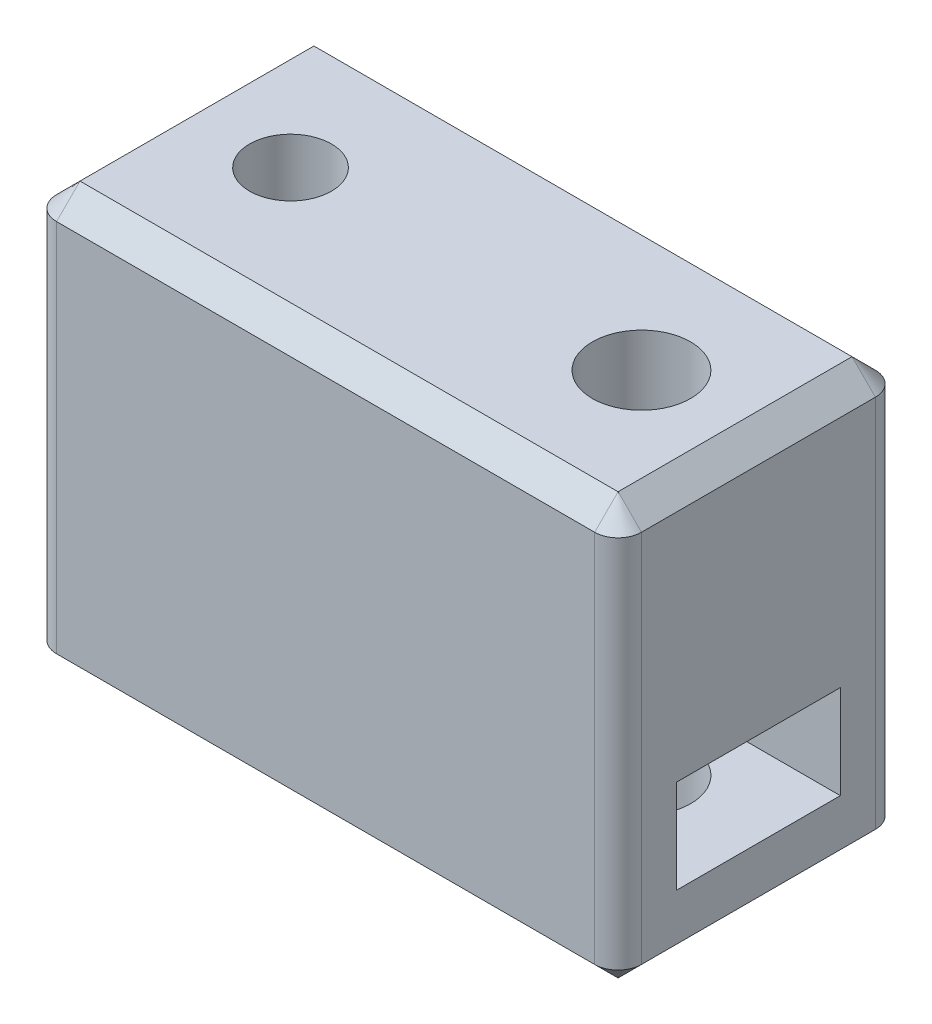
ISO-10303-21;
HEADER;
FILE_DESCRIPTION(('STEP AP214'),'2;1');
FILE_NAME('part.step','',(''),(''),'','','');
FILE_SCHEMA(('AUTOMOTIVE_DESIGN { 1 0 10303 214 1 1 1 1 }'));
ENDSEC;
DATA;
#1=APPLICATION_CONTEXT('core data for automotive mechanical design processes');
#2=APPLICATION_PROTOCOL_DEFINITION('international standard','automotive_design',2000,#1);
#3=PRODUCT_CONTEXT('',#1,'mechanical');
#4=PRODUCT('Part','Part','',(#3));
#5=PRODUCT_RELATED_PRODUCT_CATEGORY('part','',(#4));
#6=PRODUCT_DEFINITION_FORMATION('','',#4);
#7=PRODUCT_DEFINITION_CONTEXT('part definition',#1,'design');
#8=PRODUCT_DEFINITION('design','',#6,#7);
#9=PRODUCT_DEFINITION_SHAPE('','',#8);
#10=(LENGTH_UNIT() NAMED_UNIT(*) SI_UNIT(.MILLI.,.METRE.));
#11=(NAMED_UNIT(*) PLANE_ANGLE_UNIT() SI_UNIT($,.RADIAN.));
#12=(NAMED_UNIT(*) SI_UNIT($,.STERADIAN.) SOLID_ANGLE_UNIT());
#13=UNCERTAINTY_MEASURE_WITH_UNIT(LENGTH_MEASURE(1.E-05),#10,'distance_accuracy_value','');
#14=(GEOMETRIC_REPRESENTATION_CONTEXT(3) GLOBAL_UNCERTAINTY_ASSIGNED_CONTEXT((#13)) GLOBAL_UNIT_ASSIGNED_CONTEXT((#10,
#11,#12)) REPRESENTATION_CONTEXT('',''));
#15=CARTESIAN_POINT('',(0.,0.,0.));
#16=DIRECTION('',(0.,0.,1.));
#17=DIRECTION('',(1.,0.,0.));
#18=AXIS2_PLACEMENT_3D('',#15,#16,#17);
#19=CARTESIAN_POINT('',(-7.5,18.,0.));
#20=DIRECTION('',(0.,-1.,0.));
#21=DIRECTION('',(0.,0.,-1.));
#22=AXIS2_PLACEMENT_3D('',#19,#20,#21);
#23=CYLINDRICAL_SURFACE('',#22,1.75);
#24=CARTESIAN_POINT('',(-7.5,3.,0.));
#25=DIRECTION('',(0.,-1.,0.));
#26=DIRECTION('',(0.,0.,-1.));
#27=AXIS2_PLACEMENT_3D('',#24,#25,#26);
#28=CIRCLE('',#27,1.75);
#29=CARTESIAN_POINT('',(-7.5,3.,-1.75));
#30=VERTEX_POINT('',#29);
#31=EDGE_CURVE('E237',#30,#30,#28,.T.);
#32=ORIENTED_EDGE('',*,*,#31,.F.);
#33=EDGE_LOOP('',(#32));
#34=FACE_BOUND('',#33,.T.);
#35=CARTESIAN_POINT('',(-7.5,0.,0.));
#36=DIRECTION('',(0.,1.,0.));
#37=DIRECTION('',(0.,0.,1.));
#38=AXIS2_PLACEMENT_3D('',#35,#36,#37);
#39=CIRCLE('',#38,1.75);
#40=CARTESIAN_POINT('',(-7.5,0.,1.75));
#41=VERTEX_POINT('',#40);
#42=EDGE_CURVE('E257',#41,#41,#39,.T.);
#43=ORIENTED_EDGE('',*,*,#42,.F.);
#44=EDGE_LOOP('',(#43));
#45=FACE_BOUND('',#44,.T.);
#46=ADVANCED_FACE('F34',(#34,#45),#23,.F.);
#47=CARTESIAN_POINT('',(7.5,18.,0.));
#48=DIRECTION('',(0.,-1.,0.));
#49=DIRECTION('',(0.,0.,-1.));
#50=AXIS2_PLACEMENT_3D('',#47,#48,#49);
#51=CYLINDRICAL_SURFACE('',#50,2.1);
#52=CARTESIAN_POINT('',(7.5,3.,0.));
#53=DIRECTION('',(0.,-1.,0.));
#54=DIRECTION('',(0.,0.,-1.));
#55=AXIS2_PLACEMENT_3D('',#52,#53,#54);
#56=CIRCLE('',#55,2.1);
#57=CARTESIAN_POINT('',(7.5,3.,-2.1));
#58=VERTEX_POINT('',#57);
#59=EDGE_CURVE('E261',#58,#58,#56,.T.);
#60=ORIENTED_EDGE('',*,*,#59,.F.);
#61=EDGE_LOOP('',(#60));
#62=FACE_BOUND('',#61,.T.);
#63=CARTESIAN_POINT('',(7.5,0.,0.));
#64=DIRECTION('',(0.,1.,0.));
#65=DIRECTION('',(0.,0.,1.));
#66=AXIS2_PLACEMENT_3D('',#63,#64,#65);
#67=CIRCLE('',#66,2.1);
#68=CARTESIAN_POINT('',(7.5,0.,2.1));
#69=VERTEX_POINT('',#68);
#70=EDGE_CURVE('E258',#69,#69,#67,.T.);
#71=ORIENTED_EDGE('',*,*,#70,.F.);
#72=EDGE_LOOP('',(#71));
#73=FACE_BOUND('',#72,.T.);
#74=ADVANCED_FACE('F462',(#62,#73),#51,.F.);
#75=CARTESIAN_POINT('',(0.,18.,0.));
#76=DIRECTION('',(0.,1.,0.));
#77=DIRECTION('',(0.,0.,1.));
#78=AXIS2_PLACEMENT_3D('',#75,#76,#77);
#79=PLANE('',#78);
#80=DIRECTION('',(0.,0.,-1.));
#81=VECTOR('',#80,1.);
#82=CARTESIAN_POINT('',(11.5,18.,-5.));
#83=LINE('',#82,#81);
#84=CARTESIAN_POINT('',(11.5,18.,5.00000000000001));
#85=VERTEX_POINT('',#84);
#86=CARTESIAN_POINT('',(11.5,18.,-5.));
#87=VERTEX_POINT('',#86);
#88=EDGE_CURVE('E59',#85,#87,#83,.T.);
#89=ORIENTED_EDGE('',*,*,#88,.T.);
#90=DIRECTION('',(-1.,0.,0.));
#91=VECTOR('',#90,1.);
#92=CARTESIAN_POINT('',(-11.5,18.,-5.00000000000001));
#93=LINE('',#92,#91);
#94=CARTESIAN_POINT('',(-11.5,18.,-5.));
#95=VERTEX_POINT('',#94);
#96=EDGE_CURVE('E11',#87,#95,#93,.T.);
#97=ORIENTED_EDGE('',*,*,#96,.T.);
#98=DIRECTION('',(0.,0.,1.));
#99=VECTOR('',#98,1.);
#100=CARTESIAN_POINT('',(-11.5,18.,5.));
#101=LINE('',#100,#99);
#102=CARTESIAN_POINT('',(-11.5,18.,5.00000000000001));
#103=VERTEX_POINT('',#102);
#104=EDGE_CURVE('E44',#95,#103,#101,.T.);
#105=ORIENTED_EDGE('',*,*,#104,.T.);
#106=DIRECTION('',(1.,0.,0.));
#107=VECTOR('',#106,1.);
#108=CARTESIAN_POINT('',(11.5,18.,5.00000000000001));
#109=LINE('',#108,#107);
#110=EDGE_CURVE('E342',#103,#85,#109,.T.);
#111=ORIENTED_EDGE('',*,*,#110,.T.);
#112=EDGE_LOOP('',(#89,#97,#105,#111));
#113=FACE_BOUND('',#112,.T.);
#114=CARTESIAN_POINT('',(-7.5,18.,0.));
#115=DIRECTION('',(0.,1.,0.));
#116=DIRECTION('',(0.,0.,1.));
#117=AXIS2_PLACEMENT_3D('',#114,#115,#116);
#118=CIRCLE('',#117,1.75);
#119=CARTESIAN_POINT('',(-7.5,18.,1.75));
#120=VERTEX_POINT('',#119);
#121=EDGE_CURVE('E262',#120,#120,#118,.T.);
#122=ORIENTED_EDGE('',*,*,#121,.F.);
#123=EDGE_LOOP('',(#122));
#124=FACE_BOUND('',#123,.T.);
#125=CARTESIAN_POINT('',(7.5,18.,0.));
#126=DIRECTION('',(0.,1.,0.));
#127=DIRECTION('',(0.,0.,1.));
#128=AXIS2_PLACEMENT_3D('',#125,#126,#127);
#129=CIRCLE('',#128,2.1);
#130=CARTESIAN_POINT('',(7.5,18.,2.1));
#131=VERTEX_POINT('',#130);
#132=EDGE_CURVE('E254',#131,#131,#129,.T.);
#133=ORIENTED_EDGE('',*,*,#132,.F.);
#134=EDGE_LOOP('',(#133));
#135=FACE_BOUND('',#134,.T.);
#136=ADVANCED_FACE('F459',(#113,#124,#135),#79,.T.);
#137=CARTESIAN_POINT('',(0.,0.,0.));
#138=DIRECTION('',(0.,1.,0.));
#139=DIRECTION('',(0.,0.,1.));
#140=AXIS2_PLACEMENT_3D('',#137,#138,#139);
#141=PLANE('',#140);
#142=DIRECTION('',(0.,0.,-1.));
#143=VECTOR('',#142,1.);
#144=CARTESIAN_POINT('',(-11.5,0.,0.));
#145=LINE('',#144,#143);
#146=CARTESIAN_POINT('',(-11.5,0.,5.));
#147=VERTEX_POINT('',#146);
#148=CARTESIAN_POINT('',(-11.5,0.,-5.));
#149=VERTEX_POINT('',#148);
#150=EDGE_CURVE('E309',#147,#149,#145,.T.);
#151=ORIENTED_EDGE('',*,*,#150,.T.);
#152=DIRECTION('',(1.,0.,0.));
#153=VECTOR('',#152,1.);
#154=CARTESIAN_POINT('',(0.,0.,-5.));
#155=LINE('',#154,#153);
#156=CARTESIAN_POINT('',(11.5,0.,-5.));
#157=VERTEX_POINT('',#156);
#158=EDGE_CURVE('E311',#149,#157,#155,.T.);
#159=ORIENTED_EDGE('',*,*,#158,.T.);
#160=DIRECTION('',(0.,0.,1.));
#161=VECTOR('',#160,1.);
#162=CARTESIAN_POINT('',(11.5,0.,0.));
#163=LINE('',#162,#161);
#164=CARTESIAN_POINT('',(11.5,0.,5.));
#165=VERTEX_POINT('',#164);
#166=EDGE_CURVE('E307',#157,#165,#163,.T.);
#167=ORIENTED_EDGE('',*,*,#166,.T.);
#168=DIRECTION('',(-1.,0.,0.));
#169=VECTOR('',#168,1.);
#170=CARTESIAN_POINT('',(0.,0.,5.));
#171=LINE('',#170,#169);
#172=EDGE_CURVE('E305',#165,#147,#171,.T.);
#173=ORIENTED_EDGE('',*,*,#172,.T.);
#174=EDGE_LOOP('',(#151,#159,#167,#173));
#175=FACE_BOUND('',#174,.T.);
#176=ORIENTED_EDGE('',*,*,#42,.T.);
#177=EDGE_LOOP('',(#176));
#178=FACE_BOUND('',#177,.T.);
#179=ORIENTED_EDGE('',*,*,#70,.T.);
#180=EDGE_LOOP('',(#179));
#181=FACE_BOUND('',#180,.T.);
#182=ADVANCED_FACE('F415',(#175,#178,#181),#141,.F.);
#183=CARTESIAN_POINT('',(12.5,18.,-6.));
#184=DIRECTION('',(-1.,0.,0.));
#185=DIRECTION('',(0.,0.,1.));
#186=AXIS2_PLACEMENT_3D('',#183,#184,#185);
#187=PLANE('',#186);
#188=DIRECTION('',(0.,0.,1.));
#189=VECTOR('',#188,1.);
#190=CARTESIAN_POINT('',(12.5,7.,3.5));
#191=LINE('',#190,#189);
#192=CARTESIAN_POINT('',(12.5,7.,-3.5));
#193=VERTEX_POINT('',#192);
#194=CARTESIAN_POINT('',(12.5,7.,3.5));
#195=VERTEX_POINT('',#194);
#196=EDGE_CURVE('E236',#193,#195,#191,.T.);
#197=ORIENTED_EDGE('',*,*,#196,.F.);
#198=DIRECTION('',(0.,1.,0.));
#199=VECTOR('',#198,1.);
#200=CARTESIAN_POINT('',(12.5,7.,-3.5));
#201=LINE('',#200,#199);
#202=CARTESIAN_POINT('',(12.5,3.,-3.5));
#203=VERTEX_POINT('',#202);
#204=EDGE_CURVE('E234',#203,#193,#201,.T.);
#205=ORIENTED_EDGE('',*,*,#204,.F.);
#206=DIRECTION('',(0.,0.,-1.));
#207=VECTOR('',#206,1.);
#208=CARTESIAN_POINT('',(12.5,3.,3.5));
#209=LINE('',#208,#207);
#210=CARTESIAN_POINT('',(12.5,3.,3.5));
#211=VERTEX_POINT('',#210);
#212=EDGE_CURVE('E224',#211,#203,#209,.T.);
#213=ORIENTED_EDGE('',*,*,#212,.F.);
#214=DIRECTION('',(0.,-1.,0.));
#215=VECTOR('',#214,1.);
#216=CARTESIAN_POINT('',(12.5,7.,3.5));
#217=LINE('',#216,#215);
#218=EDGE_CURVE('E240',#195,#211,#217,.T.);
#219=ORIENTED_EDGE('',*,*,#218,.F.);
#220=EDGE_LOOP('',(#197,#205,#213,#219));
#221=FACE_BOUND('',#220,.T.);
#222=DIRECTION('',(0.,-1.,0.));
#223=VECTOR('',#222,1.);
#224=CARTESIAN_POINT('',(12.5,18.,5.));
#225=LINE('',#224,#223);
#226=CARTESIAN_POINT('',(12.5,17.,5.));
#227=VERTEX_POINT('',#226);
#228=CARTESIAN_POINT('',(12.5,0.999999999999997,5.));
#229=VERTEX_POINT('',#228);
#230=EDGE_CURVE('E293',#227,#229,#225,.T.);
#231=ORIENTED_EDGE('',*,*,#230,.T.);
#232=DIRECTION('',(0.,0.,-1.));
#233=VECTOR('',#232,1.);
#234=CARTESIAN_POINT('',(12.5,0.999999999999997,-6.));
#235=LINE('',#234,#233);
#236=CARTESIAN_POINT('',(12.5,0.999999999999997,-5.));
#237=VERTEX_POINT('',#236);
#238=EDGE_CURVE('E328',#229,#237,#235,.T.);
#239=ORIENTED_EDGE('',*,*,#238,.T.);
#240=DIRECTION('',(0.,-1.,0.));
#241=VECTOR('',#240,1.);
#242=CARTESIAN_POINT('',(12.5,18.,-5.));
#243=LINE('',#242,#241);
#244=CARTESIAN_POINT('',(12.5,17.,-5.));
#245=VERTEX_POINT('',#244);
#246=EDGE_CURVE('E296',#237,#245,#243,.F.);
#247=ORIENTED_EDGE('',*,*,#246,.T.);
#248=DIRECTION('',(0.,0.,1.));
#249=VECTOR('',#248,1.);
#250=CARTESIAN_POINT('',(12.5,17.,5.));
#251=LINE('',#250,#249);
#252=EDGE_CURVE('E326',#245,#227,#251,.T.);
#253=ORIENTED_EDGE('',*,*,#252,.T.);
#254=EDGE_LOOP('',(#231,#239,#247,#253));
#255=FACE_BOUND('',#254,.T.);
#256=ADVANCED_FACE('F428',(#221,#255),#187,.F.);
#257=CARTESIAN_POINT('',(-12.5,18.,-6.));
#258=DIRECTION('',(0.,0.,1.));
#259=DIRECTION('',(1.,0.,0.));
#260=AXIS2_PLACEMENT_3D('',#257,#258,#259);
#261=PLANE('',#260);
#262=DIRECTION('',(0.,-1.,0.));
#263=VECTOR('',#262,1.);
#264=CARTESIAN_POINT('',(11.5,18.,-6.));
#265=LINE('',#264,#263);
#266=CARTESIAN_POINT('',(11.5,17.,-6.));
#267=VERTEX_POINT('',#266);
#268=CARTESIAN_POINT('',(11.5,0.999999999999997,-6.));
#269=VERTEX_POINT('',#268);
#270=EDGE_CURVE('E287',#267,#269,#265,.T.);
#271=ORIENTED_EDGE('',*,*,#270,.T.);
#272=DIRECTION('',(-1.,0.,0.));
#273=VECTOR('',#272,1.);
#274=CARTESIAN_POINT('',(-12.5,0.999999999999997,-6.));
#275=LINE('',#274,#273);
#276=CARTESIAN_POINT('',(-11.5,0.999999999999997,-6.));
#277=VERTEX_POINT('',#276);
#278=EDGE_CURVE('E302',#269,#277,#275,.T.);
#279=ORIENTED_EDGE('',*,*,#278,.T.);
#280=DIRECTION('',(0.,-1.,0.));
#281=VECTOR('',#280,1.);
#282=CARTESIAN_POINT('',(-11.5,18.,-6.));
#283=LINE('',#282,#281);
#284=CARTESIAN_POINT('',(-11.5,17.,-6.));
#285=VERTEX_POINT('',#284);
#286=EDGE_CURVE('E290',#277,#285,#283,.F.);
#287=ORIENTED_EDGE('',*,*,#286,.T.);
#288=DIRECTION('',(1.,0.,0.));
#289=VECTOR('',#288,1.);
#290=CARTESIAN_POINT('',(11.5,17.,-6.));
#291=LINE('',#290,#289);
#292=EDGE_CURVE('E299',#285,#267,#291,.T.);
#293=ORIENTED_EDGE('',*,*,#292,.T.);
#294=EDGE_LOOP('',(#271,#279,#287,#293));
#295=FACE_BOUND('',#294,.T.);
#296=ADVANCED_FACE('F446',(#295),#261,.F.);
#297=CARTESIAN_POINT('',(-12.5,18.,-6.));
#298=DIRECTION('',(1.,0.,0.));
#299=DIRECTION('',(0.,0.,-1.));
#300=AXIS2_PLACEMENT_3D('',#297,#298,#299);
#301=PLANE('',#300);
#302=DIRECTION('',(0.,0.,-1.));
#303=VECTOR('',#302,1.);
#304=CARTESIAN_POINT('',(-12.5,6.,-2.75));
#305=LINE('',#304,#303);
#306=CARTESIAN_POINT('',(-12.5,6.,2.75));
#307=VERTEX_POINT('',#306);
#308=CARTESIAN_POINT('',(-12.5,6.,-2.75));
#309=VERTEX_POINT('',#308);
#310=EDGE_CURVE('E209',#307,#309,#305,.T.);
#311=ORIENTED_EDGE('',*,*,#310,.F.);
#312=DIRECTION('',(0.,1.,0.));
#313=VECTOR('',#312,1.);
#314=CARTESIAN_POINT('',(-12.5,3.,2.75));
#315=LINE('',#314,#313);
#316=CARTESIAN_POINT('',(-12.5,3.,2.75));
#317=VERTEX_POINT('',#316);
#318=EDGE_CURVE('E183',#317,#307,#315,.T.);
#319=ORIENTED_EDGE('',*,*,#318,.F.);
#320=DIRECTION('',(0.,0.,1.));
#321=VECTOR('',#320,1.);
#322=CARTESIAN_POINT('',(-12.5,3.,-2.75));
#323=LINE('',#322,#321);
#324=CARTESIAN_POINT('',(-12.5,3.,-2.75));
#325=VERTEX_POINT('',#324);
#326=EDGE_CURVE('E200',#325,#317,#323,.T.);
#327=ORIENTED_EDGE('',*,*,#326,.F.);
#328=DIRECTION('',(0.,-1.,0.));
#329=VECTOR('',#328,1.);
#330=CARTESIAN_POINT('',(-12.5,3.,-2.75));
#331=LINE('',#330,#329);
#332=EDGE_CURVE('E203',#309,#325,#331,.T.);
#333=ORIENTED_EDGE('',*,*,#332,.F.);
#334=EDGE_LOOP('',(#311,#319,#327,#333));
#335=FACE_BOUND('',#334,.T.);
#336=DIRECTION('',(0.,-1.,0.));
#337=VECTOR('',#336,1.);
#338=CARTESIAN_POINT('',(-12.5,18.,-5.));
#339=LINE('',#338,#337);
#340=CARTESIAN_POINT('',(-12.5,17.,-5.));
#341=VERTEX_POINT('',#340);
#342=CARTESIAN_POINT('',(-12.5,0.999999999999997,-5.));
#343=VERTEX_POINT('',#342);
#344=EDGE_CURVE('E281',#341,#343,#339,.T.);
#345=ORIENTED_EDGE('',*,*,#344,.T.);
#346=DIRECTION('',(0.,0.,1.));
#347=VECTOR('',#346,1.);
#348=CARTESIAN_POINT('',(-12.5,0.999999999999997,-6.));
#349=LINE('',#348,#347);
#350=CARTESIAN_POINT('',(-12.5,0.999999999999997,5.));
#351=VERTEX_POINT('',#350);
#352=EDGE_CURVE('E324',#343,#351,#349,.T.);
#353=ORIENTED_EDGE('',*,*,#352,.T.);
#354=DIRECTION('',(0.,-1.,0.));
#355=VECTOR('',#354,1.);
#356=CARTESIAN_POINT('',(-12.5,18.,5.));
#357=LINE('',#356,#355);
#358=CARTESIAN_POINT('',(-12.5,17.,5.));
#359=VERTEX_POINT('',#358);
#360=EDGE_CURVE('E284',#351,#359,#357,.F.);
#361=ORIENTED_EDGE('',*,*,#360,.T.);
#362=DIRECTION('',(0.,0.,-1.));
#363=VECTOR('',#362,1.);
#364=CARTESIAN_POINT('',(-12.5,17.,-5.));
#365=LINE('',#364,#363);
#366=EDGE_CURVE('E322',#359,#341,#365,.T.);
#367=ORIENTED_EDGE('',*,*,#366,.T.);
#368=EDGE_LOOP('',(#345,#353,#361,#367));
#369=FACE_BOUND('',#368,.T.);
#370=ADVANCED_FACE('F497',(#335,#369),#301,.F.);
#371=CARTESIAN_POINT('',(-12.5,18.,6.));
#372=DIRECTION('',(0.,0.,-1.));
#373=DIRECTION('',(-1.,0.,0.));
#374=AXIS2_PLACEMENT_3D('',#371,#372,#373);
#375=PLANE('',#374);
#376=DIRECTION('',(0.,-1.,0.));
#377=VECTOR('',#376,1.);
#378=CARTESIAN_POINT('',(-11.5,18.,6.));
#379=LINE('',#378,#377);
#380=CARTESIAN_POINT('',(-11.5,17.,6.));
#381=VERTEX_POINT('',#380);
#382=CARTESIAN_POINT('',(-11.5,0.999999999999997,6.));
#383=VERTEX_POINT('',#382);
#384=EDGE_CURVE('E278',#381,#383,#379,.T.);
#385=ORIENTED_EDGE('',*,*,#384,.T.);
#386=DIRECTION('',(1.,0.,0.));
#387=VECTOR('',#386,1.);
#388=CARTESIAN_POINT('',(-12.5,0.999999999999997,6.));
#389=LINE('',#388,#387);
#390=CARTESIAN_POINT('',(11.5,0.999999999999997,6.));
#391=VERTEX_POINT('',#390);
#392=EDGE_CURVE('E340',#383,#391,#389,.T.);
#393=ORIENTED_EDGE('',*,*,#392,.T.);
#394=DIRECTION('',(0.,-1.,0.));
#395=VECTOR('',#394,1.);
#396=CARTESIAN_POINT('',(11.5,18.,6.));
#397=LINE('',#396,#395);
#398=CARTESIAN_POINT('',(11.5,17.,6.));
#399=VERTEX_POINT('',#398);
#400=EDGE_CURVE('E265',#391,#399,#397,.F.);
#401=ORIENTED_EDGE('',*,*,#400,.T.);
#402=DIRECTION('',(-1.,0.,0.));
#403=VECTOR('',#402,1.);
#404=CARTESIAN_POINT('',(-11.5,17.,6.));
#405=LINE('',#404,#403);
#406=EDGE_CURVE('E338',#399,#381,#405,.T.);
#407=ORIENTED_EDGE('',*,*,#406,.T.);
#408=EDGE_LOOP('',(#385,#393,#401,#407));
#409=FACE_BOUND('',#408,.T.);
#410=ADVANCED_FACE('F397',(#409),#375,.F.);
#411=CARTESIAN_POINT('',(-7.5,6.,0.));
#412=DIRECTION('',(0.,1.,0.));
#413=DIRECTION('',(0.,0.,1.));
#414=AXIS2_PLACEMENT_3D('',#411,#412,#413);
#415=CIRCLE('',#414,1.75);
#416=CARTESIAN_POINT('',(-7.5,6.,1.75));
#417=VERTEX_POINT('',#416);
#418=EDGE_CURVE('E216',#417,#417,#415,.T.);
#419=ORIENTED_EDGE('',*,*,#418,.F.);
#420=EDGE_LOOP('',(#419));
#421=FACE_BOUND('',#420,.T.);
#422=ORIENTED_EDGE('',*,*,#121,.T.);
#423=EDGE_LOOP('',(#422));
#424=FACE_BOUND('',#423,.T.);
#425=ADVANCED_FACE('F471',(#421,#424),#23,.F.);
#426=CARTESIAN_POINT('',(7.5,7.,0.));
#427=DIRECTION('',(0.,1.,0.));
#428=DIRECTION('',(0.,0.,1.));
#429=AXIS2_PLACEMENT_3D('',#426,#427,#428);
#430=CIRCLE('',#429,2.1);
#431=CARTESIAN_POINT('',(7.5,7.,2.1));
#432=VERTEX_POINT('',#431);
#433=EDGE_CURVE('E247',#432,#432,#430,.T.);
#434=ORIENTED_EDGE('',*,*,#433,.F.);
#435=EDGE_LOOP('',(#434));
#436=FACE_BOUND('',#435,.T.);
#437=ORIENTED_EDGE('',*,*,#132,.T.);
#438=EDGE_LOOP('',(#437));
#439=FACE_BOUND('',#438,.T.);
#440=ADVANCED_FACE('F468',(#436,#439),#51,.F.);
#441=CARTESIAN_POINT('',(2.5,7.,-3.5));
#442=DIRECTION('',(0.,0.,-1.));
#443=DIRECTION('',(0.,1.,0.));
#444=AXIS2_PLACEMENT_3D('',#441,#442,#443);
#445=PLANE('',#444);
#446=ORIENTED_EDGE('',*,*,#204,.T.);
#447=DIRECTION('',(1.,0.,0.));
#448=VECTOR('',#447,1.);
#449=CARTESIAN_POINT('',(2.5,7.,-3.5));
#450=LINE('',#449,#448);
#451=CARTESIAN_POINT('',(2.5,7.,-3.5));
#452=VERTEX_POINT('',#451);
#453=EDGE_CURVE('E233',#452,#193,#450,.T.);
#454=ORIENTED_EDGE('',*,*,#453,.F.);
#455=DIRECTION('',(0.,1.,0.));
#456=VECTOR('',#455,1.);
#457=CARTESIAN_POINT('',(2.5,7.,-3.5));
#458=LINE('',#457,#456);
#459=CARTESIAN_POINT('',(2.5,3.,-3.5));
#460=VERTEX_POINT('',#459);
#461=EDGE_CURVE('E220',#460,#452,#458,.T.);
#462=ORIENTED_EDGE('',*,*,#461,.F.);
#463=DIRECTION('',(1.,0.,0.));
#464=VECTOR('',#463,1.);
#465=CARTESIAN_POINT('',(2.5,3.,-3.5));
#466=LINE('',#465,#464);
#467=EDGE_CURVE('E245',#460,#203,#466,.T.);
#468=ORIENTED_EDGE('',*,*,#467,.T.);
#469=EDGE_LOOP('',(#446,#454,#462,#468));
#470=FACE_BOUND('',#469,.T.);
#471=ADVANCED_FACE('F470',(#470),#445,.F.);
#472=CARTESIAN_POINT('',(2.5,3.,3.5));
#473=DIRECTION('',(0.,-1.,0.));
#474=DIRECTION('',(0.,0.,-1.));
#475=AXIS2_PLACEMENT_3D('',#472,#473,#474);
#476=PLANE('',#475);
#477=ORIENTED_EDGE('',*,*,#59,.T.);
#478=EDGE_LOOP('',(#477));
#479=FACE_BOUND('',#478,.T.);
#480=ORIENTED_EDGE('',*,*,#212,.T.);
#481=ORIENTED_EDGE('',*,*,#467,.F.);
#482=DIRECTION('',(0.,0.,-1.));
#483=VECTOR('',#482,1.);
#484=CARTESIAN_POINT('',(2.5,3.,3.5));
#485=LINE('',#484,#483);
#486=CARTESIAN_POINT('',(2.5,3.,3.5));
#487=VERTEX_POINT('',#486);
#488=EDGE_CURVE('E230',#487,#460,#485,.T.);
#489=ORIENTED_EDGE('',*,*,#488,.F.);
#490=DIRECTION('',(1.,0.,0.));
#491=VECTOR('',#490,1.);
#492=CARTESIAN_POINT('',(2.5,3.,3.5));
#493=LINE('',#492,#491);
#494=EDGE_CURVE('E248',#487,#211,#493,.T.);
#495=ORIENTED_EDGE('',*,*,#494,.T.);
#496=EDGE_LOOP('',(#480,#481,#489,#495));
#497=FACE_BOUND('',#496,.T.);
#498=ADVANCED_FACE('F478',(#479,#497),#476,.F.);
#499=CARTESIAN_POINT('',(2.5,7.,3.5));
#500=DIRECTION('',(0.,0.,1.));
#501=DIRECTION('',(1.,0.,0.));
#502=AXIS2_PLACEMENT_3D('',#499,#500,#501);
#503=PLANE('',#502);
#504=ORIENTED_EDGE('',*,*,#218,.T.);
#505=ORIENTED_EDGE('',*,*,#494,.F.);
#506=DIRECTION('',(0.,-1.,0.));
#507=VECTOR('',#506,1.);
#508=CARTESIAN_POINT('',(2.5,7.,3.5));
#509=LINE('',#508,#507);
#510=CARTESIAN_POINT('',(2.5,7.,3.5));
#511=VERTEX_POINT('',#510);
#512=EDGE_CURVE('E227',#511,#487,#509,.T.);
#513=ORIENTED_EDGE('',*,*,#512,.F.);
#514=DIRECTION('',(1.,0.,0.));
#515=VECTOR('',#514,1.);
#516=CARTESIAN_POINT('',(2.5,7.,3.5));
#517=LINE('',#516,#515);
#518=EDGE_CURVE('E250',#511,#195,#517,.T.);
#519=ORIENTED_EDGE('',*,*,#518,.T.);
#520=EDGE_LOOP('',(#504,#505,#513,#519));
#521=FACE_BOUND('',#520,.T.);
#522=ADVANCED_FACE('F704',(#521),#503,.F.);
#523=CARTESIAN_POINT('',(2.5,7.,3.5));
#524=DIRECTION('',(0.,1.,0.));
#525=DIRECTION('',(0.,0.,1.));
#526=AXIS2_PLACEMENT_3D('',#523,#524,#525);
#527=PLANE('',#526);
#528=ORIENTED_EDGE('',*,*,#433,.T.);
#529=EDGE_LOOP('',(#528));
#530=FACE_BOUND('',#529,.T.);
#531=ORIENTED_EDGE('',*,*,#196,.T.);
#532=ORIENTED_EDGE('',*,*,#518,.F.);
#533=DIRECTION('',(0.,0.,1.));
#534=VECTOR('',#533,1.);
#535=CARTESIAN_POINT('',(2.5,7.,3.5));
#536=LINE('',#535,#534);
#537=EDGE_CURVE('E223',#452,#511,#536,.T.);
#538=ORIENTED_EDGE('',*,*,#537,.F.);
#539=ORIENTED_EDGE('',*,*,#453,.T.);
#540=EDGE_LOOP('',(#531,#532,#538,#539));
#541=FACE_BOUND('',#540,.T.);
#542=ADVANCED_FACE('F696',(#530,#541),#527,.F.);
#543=CARTESIAN_POINT('',(2.5,0.,0.));
#544=DIRECTION('',(1.,0.,0.));
#545=DIRECTION('',(0.,0.,-1.));
#546=AXIS2_PLACEMENT_3D('',#543,#544,#545);
#547=PLANE('',#546);
#548=ORIENTED_EDGE('',*,*,#461,.T.);
#549=ORIENTED_EDGE('',*,*,#537,.T.);
#550=ORIENTED_EDGE('',*,*,#512,.T.);
#551=ORIENTED_EDGE('',*,*,#488,.T.);
#552=EDGE_LOOP('',(#548,#549,#550,#551));
#553=FACE_BOUND('',#552,.T.);
#554=ADVANCED_FACE('F688',(#553),#547,.T.);
#555=CARTESIAN_POINT('',(-4.5,3.,2.75));
#556=DIRECTION('',(0.,0.,1.));
#557=DIRECTION('',(1.,0.,0.));
#558=AXIS2_PLACEMENT_3D('',#555,#556,#557);
#559=PLANE('',#558);
#560=ORIENTED_EDGE('',*,*,#318,.T.);
#561=DIRECTION('',(-1.,0.,0.));
#562=VECTOR('',#561,1.);
#563=CARTESIAN_POINT('',(-4.5,6.,2.75));
#564=LINE('',#563,#562);
#565=CARTESIAN_POINT('',(-4.5,6.,2.75));
#566=VERTEX_POINT('',#565);
#567=EDGE_CURVE('E176',#566,#307,#564,.T.);
#568=ORIENTED_EDGE('',*,*,#567,.F.);
#569=DIRECTION('',(0.,1.,0.));
#570=VECTOR('',#569,1.);
#571=CARTESIAN_POINT('',(-4.5,3.,2.75));
#572=LINE('',#571,#570);
#573=CARTESIAN_POINT('',(-4.5,3.,2.75));
#574=VERTEX_POINT('',#573);
#575=EDGE_CURVE('E180',#574,#566,#572,.T.);
#576=ORIENTED_EDGE('',*,*,#575,.F.);
#577=DIRECTION('',(-1.,0.,0.));
#578=VECTOR('',#577,1.);
#579=CARTESIAN_POINT('',(-4.5,3.,2.75));
#580=LINE('',#579,#578);
#581=EDGE_CURVE('E214',#574,#317,#580,.T.);
#582=ORIENTED_EDGE('',*,*,#581,.T.);
#583=EDGE_LOOP('',(#560,#568,#576,#582));
#584=FACE_BOUND('',#583,.T.);
#585=ADVANCED_FACE('F178',(#584),#559,.F.);
#586=CARTESIAN_POINT('',(-4.5,3.,-2.75));
#587=DIRECTION('',(0.,-1.,0.));
#588=DIRECTION('',(0.,0.,-1.));
#589=AXIS2_PLACEMENT_3D('',#586,#587,#588);
#590=PLANE('',#589);
#591=ORIENTED_EDGE('',*,*,#31,.T.);
#592=EDGE_LOOP('',(#591));
#593=FACE_BOUND('',#592,.T.);
#594=ORIENTED_EDGE('',*,*,#326,.T.);
#595=ORIENTED_EDGE('',*,*,#581,.F.);
#596=DIRECTION('',(0.,0.,1.));
#597=VECTOR('',#596,1.);
#598=CARTESIAN_POINT('',(-4.5,3.,-2.75));
#599=LINE('',#598,#597);
#600=CARTESIAN_POINT('',(-4.5,3.,-2.75));
#601=VERTEX_POINT('',#600);
#602=EDGE_CURVE('E188',#601,#574,#599,.T.);
#603=ORIENTED_EDGE('',*,*,#602,.F.);
#604=DIRECTION('',(-1.,0.,0.));
#605=VECTOR('',#604,1.);
#606=CARTESIAN_POINT('',(-4.5,3.,-2.75));
#607=LINE('',#606,#605);
#608=EDGE_CURVE('E217',#601,#325,#607,.T.);
#609=ORIENTED_EDGE('',*,*,#608,.T.);
#610=EDGE_LOOP('',(#594,#595,#603,#609));
#611=FACE_BOUND('',#610,.T.);
#612=ADVANCED_FACE('F673',(#593,#611),#590,.F.);
#613=CARTESIAN_POINT('',(-4.5,3.,-2.75));
#614=DIRECTION('',(0.,0.,-1.));
#615=DIRECTION('',(-1.,0.,0.));
#616=AXIS2_PLACEMENT_3D('',#613,#614,#615);
#617=PLANE('',#616);
#618=ORIENTED_EDGE('',*,*,#332,.T.);
#619=ORIENTED_EDGE('',*,*,#608,.F.);
#620=DIRECTION('',(0.,-1.,0.));
#621=VECTOR('',#620,1.);
#622=CARTESIAN_POINT('',(-4.5,3.,-2.75));
#623=LINE('',#622,#621);
#624=CARTESIAN_POINT('',(-4.5,6.,-2.75));
#625=VERTEX_POINT('',#624);
#626=EDGE_CURVE('E196',#625,#601,#623,.T.);
#627=ORIENTED_EDGE('',*,*,#626,.F.);
#628=DIRECTION('',(-1.,0.,0.));
#629=VECTOR('',#628,1.);
#630=CARTESIAN_POINT('',(-4.5,6.,-2.75));
#631=LINE('',#630,#629);
#632=EDGE_CURVE('E187',#625,#309,#631,.T.);
#633=ORIENTED_EDGE('',*,*,#632,.T.);
#634=EDGE_LOOP('',(#618,#619,#627,#633));
#635=FACE_BOUND('',#634,.T.);
#636=ADVANCED_FACE('F665',(#635),#617,.F.);
#637=CARTESIAN_POINT('',(-4.5,6.,-2.75));
#638=DIRECTION('',(0.,1.,0.));
#639=DIRECTION('',(0.,0.,1.));
#640=AXIS2_PLACEMENT_3D('',#637,#638,#639);
#641=PLANE('',#640);
#642=ORIENTED_EDGE('',*,*,#418,.T.);
#643=EDGE_LOOP('',(#642));
#644=FACE_BOUND('',#643,.T.);
#645=ORIENTED_EDGE('',*,*,#310,.T.);
#646=ORIENTED_EDGE('',*,*,#632,.F.);
#647=DIRECTION('',(0.,0.,-1.));
#648=VECTOR('',#647,1.);
#649=CARTESIAN_POINT('',(-4.5,6.,-2.75));
#650=LINE('',#649,#648);
#651=EDGE_CURVE('E191',#566,#625,#650,.T.);
#652=ORIENTED_EDGE('',*,*,#651,.F.);
#653=ORIENTED_EDGE('',*,*,#567,.T.);
#654=EDGE_LOOP('',(#645,#646,#652,#653));
#655=FACE_BOUND('',#654,.T.);
#656=ADVANCED_FACE('F192',(#644,#655),#641,.F.);
#657=CARTESIAN_POINT('',(-4.5,0.,0.));
#658=DIRECTION('',(1.,0.,0.));
#659=DIRECTION('',(0.,0.,-1.));
#660=AXIS2_PLACEMENT_3D('',#657,#658,#659);
#661=PLANE('',#660);
#662=ORIENTED_EDGE('',*,*,#575,.T.);
#663=ORIENTED_EDGE('',*,*,#651,.T.);
#664=ORIENTED_EDGE('',*,*,#626,.T.);
#665=ORIENTED_EDGE('',*,*,#602,.T.);
#666=EDGE_LOOP('',(#662,#663,#664,#665));
#667=FACE_BOUND('',#666,.T.);
#668=ADVANCED_FACE('F198',(#667),#661,.F.);
#669=CARTESIAN_POINT('',(-11.5,18.,5.));
#670=DIRECTION('',(0.,-1.,0.));
#671=DIRECTION('',(0.,0.,-1.));
#672=AXIS2_PLACEMENT_3D('',#669,#670,#671);
#673=CYLINDRICAL_SURFACE('',#672,1.);
#674=ORIENTED_EDGE('',*,*,#360,.F.);
#675=CARTESIAN_POINT('',(-11.5,0.999999999999997,5.));
#676=DIRECTION('',(0.,1.,0.));
#677=DIRECTION('',(0.,0.,1.));
#678=AXIS2_PLACEMENT_3D('',#675,#676,#677);
#679=CIRCLE('',#678,1.);
#680=EDGE_CURVE('E332',#351,#383,#679,.T.);
#681=ORIENTED_EDGE('',*,*,#680,.T.);
#682=ORIENTED_EDGE('',*,*,#384,.F.);
#683=CARTESIAN_POINT('',(-11.5,17.,5.));
#684=DIRECTION('',(0.,1.,0.));
#685=DIRECTION('',(0.,0.,1.));
#686=AXIS2_PLACEMENT_3D('',#683,#684,#685);
#687=CIRCLE('',#686,1.);
#688=EDGE_CURVE('E330',#381,#359,#687,.F.);
#689=ORIENTED_EDGE('',*,*,#688,.T.);
#690=EDGE_LOOP('',(#674,#681,#682,#689));
#691=FACE_BOUND('',#690,.T.);
#692=ADVANCED_FACE('F402',(#691),#673,.T.);
#693=CARTESIAN_POINT('',(-11.5,18.,-5.));
#694=DIRECTION('',(0.,-1.,0.));
#695=DIRECTION('',(0.,0.,-1.));
#696=AXIS2_PLACEMENT_3D('',#693,#694,#695);
#697=CYLINDRICAL_SURFACE('',#696,1.);
#698=ORIENTED_EDGE('',*,*,#286,.F.);
#699=CARTESIAN_POINT('',(-11.5,0.999999999999997,-5.));
#700=DIRECTION('',(0.,1.,0.));
#701=DIRECTION('',(0.,0.,1.));
#702=AXIS2_PLACEMENT_3D('',#699,#700,#701);
#703=CIRCLE('',#702,1.);
#704=EDGE_CURVE('E316',#277,#343,#703,.T.);
#705=ORIENTED_EDGE('',*,*,#704,.T.);
#706=ORIENTED_EDGE('',*,*,#344,.F.);
#707=CARTESIAN_POINT('',(-11.5,17.,-5.));
#708=DIRECTION('',(0.,1.,0.));
#709=DIRECTION('',(0.,0.,1.));
#710=AXIS2_PLACEMENT_3D('',#707,#708,#709);
#711=CIRCLE('',#710,1.);
#712=EDGE_CURVE('E314',#341,#285,#711,.F.);
#713=ORIENTED_EDGE('',*,*,#712,.T.);
#714=EDGE_LOOP('',(#698,#705,#706,#713));
#715=FACE_BOUND('',#714,.T.);
#716=ADVANCED_FACE('F508',(#715),#697,.T.);
#717=CARTESIAN_POINT('',(11.5,18.,-5.));
#718=DIRECTION('',(0.,-1.,0.));
#719=DIRECTION('',(0.,0.,-1.));
#720=AXIS2_PLACEMENT_3D('',#717,#718,#719);
#721=CYLINDRICAL_SURFACE('',#720,1.);
#722=ORIENTED_EDGE('',*,*,#246,.F.);
#723=CARTESIAN_POINT('',(11.5,0.999999999999997,-5.));
#724=DIRECTION('',(0.,1.,0.));
#725=DIRECTION('',(0.,0.,1.));
#726=AXIS2_PLACEMENT_3D('',#723,#724,#725);
#727=CIRCLE('',#726,1.);
#728=EDGE_CURVE('E320',#237,#269,#727,.T.);
#729=ORIENTED_EDGE('',*,*,#728,.T.);
#730=ORIENTED_EDGE('',*,*,#270,.F.);
#731=CARTESIAN_POINT('',(11.5,17.,-5.));
#732=DIRECTION('',(0.,1.,0.));
#733=DIRECTION('',(0.,0.,1.));
#734=AXIS2_PLACEMENT_3D('',#731,#732,#733);
#735=CIRCLE('',#734,1.);
#736=EDGE_CURVE('E318',#267,#245,#735,.F.);
#737=ORIENTED_EDGE('',*,*,#736,.T.);
#738=EDGE_LOOP('',(#722,#729,#730,#737));
#739=FACE_BOUND('',#738,.T.);
#740=ADVANCED_FACE('F444',(#739),#721,.T.);
#741=CARTESIAN_POINT('',(11.5,18.,5.));
#742=DIRECTION('',(0.,-1.,0.));
#743=DIRECTION('',(0.,0.,-1.));
#744=AXIS2_PLACEMENT_3D('',#741,#742,#743);
#745=CYLINDRICAL_SURFACE('',#744,1.);
#746=ORIENTED_EDGE('',*,*,#400,.F.);
#747=CARTESIAN_POINT('',(11.5,0.999999999999997,5.));
#748=DIRECTION('',(0.,1.,0.));
#749=DIRECTION('',(0.,0.,1.));
#750=AXIS2_PLACEMENT_3D('',#747,#748,#749);
#751=CIRCLE('',#750,1.);
#752=EDGE_CURVE('E336',#391,#229,#751,.T.);
#753=ORIENTED_EDGE('',*,*,#752,.T.);
#754=ORIENTED_EDGE('',*,*,#230,.F.);
#755=CARTESIAN_POINT('',(11.5,17.,5.));
#756=DIRECTION('',(0.,1.,0.));
#757=DIRECTION('',(0.,0.,1.));
#758=AXIS2_PLACEMENT_3D('',#755,#756,#757);
#759=CIRCLE('',#758,1.);
#760=EDGE_CURVE('E334',#227,#399,#759,.F.);
#761=ORIENTED_EDGE('',*,*,#760,.T.);
#762=EDGE_LOOP('',(#746,#753,#754,#761));
#763=FACE_BOUND('',#762,.T.);
#764=ADVANCED_FACE('F424',(#763),#745,.T.);
#765=CARTESIAN_POINT('',(-12.5,0.999999999999997,6.));
#766=DIRECTION('',(0.,0.70710678118655,-0.707106781186545));
#767=DIRECTION('',(1.,0.,0.));
#768=AXIS2_PLACEMENT_3D('',#765,#766,#767);
#769=PLANE('',#768);
#770=DIRECTION('',(0.,-0.707106781186545,-0.70710678118655));
#771=VECTOR('',#770,1.);
#772=CARTESIAN_POINT('',(11.5,0.999999999999997,6.));
#773=LINE('',#772,#771);
#774=EDGE_CURVE('E210',#391,#165,#773,.T.);
#775=ORIENTED_EDGE('',*,*,#774,.F.);
#776=ORIENTED_EDGE('',*,*,#392,.F.);
#777=DIRECTION('',(0.,0.707106781186545,0.70710678118655));
#778=VECTOR('',#777,1.);
#779=CARTESIAN_POINT('',(-11.5,0.,5.));
#780=LINE('',#779,#778);
#781=EDGE_CURVE('E362',#147,#383,#780,.T.);
#782=ORIENTED_EDGE('',*,*,#781,.F.);
#783=ORIENTED_EDGE('',*,*,#172,.F.);
#784=EDGE_LOOP('',(#775,#776,#782,#783));
#785=FACE_BOUND('',#784,.T.);
#786=ADVANCED_FACE('F421',(#785),#769,.F.);
#787=CARTESIAN_POINT('',(11.5,0.999999999999997,5.));
#788=DIRECTION('',(0.,1.,0.));
#789=DIRECTION('',(0.,0.,1.));
#790=AXIS2_PLACEMENT_3D('',#787,#788,#789);
#791=CONICAL_SURFACE('',#790,1.,0.785398163397452);
#792=ORIENTED_EDGE('',*,*,#752,.F.);
#793=ORIENTED_EDGE('',*,*,#774,.T.);
#794=DIRECTION('',(-0.70710678118655,-0.707106781186545,0.));
#795=VECTOR('',#794,1.);
#796=CARTESIAN_POINT('',(12.5,0.999999999999997,5.));
#797=LINE('',#796,#795);
#798=EDGE_CURVE('E359',#229,#165,#797,.T.);
#799=ORIENTED_EDGE('',*,*,#798,.F.);
#800=EDGE_LOOP('',(#792,#793,#799));
#801=FACE_BOUND('',#800,.T.);
#802=ADVANCED_FACE('F433',(#801),#791,.T.);
#803=CARTESIAN_POINT('',(-11.5,0.999999999999997,5.));
#804=DIRECTION('',(0.,1.,0.));
#805=DIRECTION('',(0.,0.,1.));
#806=AXIS2_PLACEMENT_3D('',#803,#804,#805);
#807=CONICAL_SURFACE('',#806,1.,0.785398163397452);
#808=ORIENTED_EDGE('',*,*,#781,.T.);
#809=ORIENTED_EDGE('',*,*,#680,.F.);
#810=DIRECTION('',(-0.70710678118655,0.707106781186545,0.));
#811=VECTOR('',#810,1.);
#812=CARTESIAN_POINT('',(-11.5,0.,5.));
#813=LINE('',#812,#811);
#814=EDGE_CURVE('E356',#147,#351,#813,.T.);
#815=ORIENTED_EDGE('',*,*,#814,.F.);
#816=EDGE_LOOP('',(#808,#809,#815));
#817=FACE_BOUND('',#816,.T.);
#818=ADVANCED_FACE('F406',(#817),#807,.T.);
#819=CARTESIAN_POINT('',(12.5,0.999999999999997,-6.));
#820=DIRECTION('',(-0.707106781186545,0.70710678118655,0.));
#821=DIRECTION('',(0.,0.,-1.));
#822=AXIS2_PLACEMENT_3D('',#819,#820,#821);
#823=PLANE('',#822);
#824=ORIENTED_EDGE('',*,*,#798,.T.);
#825=ORIENTED_EDGE('',*,*,#166,.F.);
#826=DIRECTION('',(-0.70710678118655,-0.707106781186545,0.));
#827=VECTOR('',#826,1.);
#828=CARTESIAN_POINT('',(12.5,0.999999999999997,-5.));
#829=LINE('',#828,#827);
#830=EDGE_CURVE('E353',#237,#157,#829,.T.);
#831=ORIENTED_EDGE('',*,*,#830,.F.);
#832=ORIENTED_EDGE('',*,*,#238,.F.);
#833=EDGE_LOOP('',(#824,#825,#831,#832));
#834=FACE_BOUND('',#833,.T.);
#835=ADVANCED_FACE('F436',(#834),#823,.F.);
#836=CARTESIAN_POINT('',(-12.5,0.999999999999997,-6.));
#837=DIRECTION('',(0.707106781186545,0.70710678118655,0.));
#838=DIRECTION('',(0.,0.,1.));
#839=AXIS2_PLACEMENT_3D('',#836,#837,#838);
#840=PLANE('',#839);
#841=ORIENTED_EDGE('',*,*,#814,.T.);
#842=ORIENTED_EDGE('',*,*,#352,.F.);
#843=DIRECTION('',(-0.70710678118655,0.707106781186545,0.));
#844=VECTOR('',#843,1.);
#845=CARTESIAN_POINT('',(-11.5,0.,-5.));
#846=LINE('',#845,#844);
#847=EDGE_CURVE('E350',#149,#343,#846,.T.);
#848=ORIENTED_EDGE('',*,*,#847,.F.);
#849=ORIENTED_EDGE('',*,*,#150,.F.);
#850=EDGE_LOOP('',(#841,#842,#848,#849));
#851=FACE_BOUND('',#850,.T.);
#852=ADVANCED_FACE('F411',(#851),#840,.F.);
#853=CARTESIAN_POINT('',(11.5,0.999999999999997,-5.));
#854=DIRECTION('',(0.,1.,0.));
#855=DIRECTION('',(0.,0.,1.));
#856=AXIS2_PLACEMENT_3D('',#853,#854,#855);
#857=CONICAL_SURFACE('',#856,1.,0.785398163397452);
#858=ORIENTED_EDGE('',*,*,#728,.F.);
#859=ORIENTED_EDGE('',*,*,#830,.T.);
#860=DIRECTION('',(0.,-0.707106781186545,0.70710678118655));
#861=VECTOR('',#860,1.);
#862=CARTESIAN_POINT('',(11.5,0.999999999999997,-6.));
#863=LINE('',#862,#861);
#864=EDGE_CURVE('E348',#269,#157,#863,.T.);
#865=ORIENTED_EDGE('',*,*,#864,.F.);
#866=EDGE_LOOP('',(#858,#859,#865));
#867=FACE_BOUND('',#866,.T.);
#868=ADVANCED_FACE('F440',(#867),#857,.T.);
#869=CARTESIAN_POINT('',(-11.5,0.999999999999997,-5.));
#870=DIRECTION('',(0.,1.,0.));
#871=DIRECTION('',(0.,0.,1.));
#872=AXIS2_PLACEMENT_3D('',#869,#870,#871);
#873=CONICAL_SURFACE('',#872,1.,0.785398163397452);
#874=ORIENTED_EDGE('',*,*,#847,.T.);
#875=ORIENTED_EDGE('',*,*,#704,.F.);
#876=DIRECTION('',(0.,0.707106781186545,-0.70710678118655));
#877=VECTOR('',#876,1.);
#878=CARTESIAN_POINT('',(-11.5,0.,-5.));
#879=LINE('',#878,#877);
#880=EDGE_CURVE('E346',#149,#277,#879,.T.);
#881=ORIENTED_EDGE('',*,*,#880,.F.);
#882=EDGE_LOOP('',(#874,#875,#881));
#883=FACE_BOUND('',#882,.T.);
#884=ADVANCED_FACE('F523',(#883),#873,.T.);
#885=CARTESIAN_POINT('',(-12.5,0.999999999999997,-6.));
#886=DIRECTION('',(0.,0.70710678118655,0.707106781186545));
#887=DIRECTION('',(-1.,0.,0.));
#888=AXIS2_PLACEMENT_3D('',#885,#886,#887);
#889=PLANE('',#888);
#890=ORIENTED_EDGE('',*,*,#864,.T.);
#891=ORIENTED_EDGE('',*,*,#158,.F.);
#892=ORIENTED_EDGE('',*,*,#880,.T.);
#893=ORIENTED_EDGE('',*,*,#278,.F.);
#894=EDGE_LOOP('',(#890,#891,#892,#893));
#895=FACE_BOUND('',#894,.T.);
#896=ADVANCED_FACE('F517',(#895),#889,.F.);
#897=CARTESIAN_POINT('',(0.,18.,5.00000000000001));
#898=DIRECTION('',(0.,0.707106781186545,0.70710678118655));
#899=DIRECTION('',(-1.,0.,0.));
#900=AXIS2_PLACEMENT_3D('',#897,#898,#899);
#901=PLANE('',#900);
#902=DIRECTION('',(0.,0.70710678118655,-0.707106781186545));
#903=VECTOR('',#902,1.);
#904=CARTESIAN_POINT('',(-11.5,17.,6.));
#905=LINE('',#904,#903);
#906=EDGE_CURVE('E380',#381,#103,#905,.T.);
#907=ORIENTED_EDGE('',*,*,#906,.F.);
#908=ORIENTED_EDGE('',*,*,#406,.F.);
#909=DIRECTION('',(0.,-0.70710678118655,0.707106781186545));
#910=VECTOR('',#909,1.);
#911=CARTESIAN_POINT('',(11.5,18.,5.00000000000001));
#912=LINE('',#911,#910);
#913=EDGE_CURVE('E39',#85,#399,#912,.T.);
#914=ORIENTED_EDGE('',*,*,#913,.F.);
#915=ORIENTED_EDGE('',*,*,#110,.F.);
#916=EDGE_LOOP('',(#907,#908,#914,#915));
#917=FACE_BOUND('',#916,.T.);
#918=ADVANCED_FACE('F37',(#917),#901,.T.);
#919=CARTESIAN_POINT('',(11.5,17.,5.));
#920=DIRECTION('',(0.,-1.,0.));
#921=DIRECTION('',(0.,0.,-1.));
#922=AXIS2_PLACEMENT_3D('',#919,#920,#921);
#923=CONICAL_SURFACE('',#922,0.999999999999994,0.785398163397445);
#924=ORIENTED_EDGE('',*,*,#913,.T.);
#925=ORIENTED_EDGE('',*,*,#760,.F.);
#926=DIRECTION('',(0.707106781186545,-0.70710678118655,0.));
#927=VECTOR('',#926,1.);
#928=CARTESIAN_POINT('',(11.5,18.,5.));
#929=LINE('',#928,#927);
#930=EDGE_CURVE('E378',#85,#227,#929,.T.);
#931=ORIENTED_EDGE('',*,*,#930,.F.);
#932=EDGE_LOOP('',(#924,#925,#931));
#933=FACE_BOUND('',#932,.T.);
#934=ADVANCED_FACE('F391',(#933),#923,.T.);
#935=CARTESIAN_POINT('',(-11.5,17.,5.));
#936=DIRECTION('',(0.,-1.,0.));
#937=DIRECTION('',(0.,0.,-1.));
#938=AXIS2_PLACEMENT_3D('',#935,#936,#937);
#939=CONICAL_SURFACE('',#938,0.999999999999994,0.785398163397445);
#940=ORIENTED_EDGE('',*,*,#688,.F.);
#941=ORIENTED_EDGE('',*,*,#906,.T.);
#942=DIRECTION('',(0.707106781186545,0.70710678118655,0.));
#943=VECTOR('',#942,1.);
#944=CARTESIAN_POINT('',(-12.5,17.,5.));
#945=LINE('',#944,#943);
#946=EDGE_CURVE('E375',#359,#103,#945,.T.);
#947=ORIENTED_EDGE('',*,*,#946,.F.);
#948=EDGE_LOOP('',(#940,#941,#947));
#949=FACE_BOUND('',#948,.T.);
#950=ADVANCED_FACE('F589',(#949),#939,.T.);
#951=CARTESIAN_POINT('',(11.5,18.,0.));
#952=DIRECTION('',(0.70710678118655,0.707106781186545,0.));
#953=DIRECTION('',(0.,0.,1.));
#954=AXIS2_PLACEMENT_3D('',#951,#952,#953);
#955=PLANE('',#954);
#956=ORIENTED_EDGE('',*,*,#930,.T.);
#957=ORIENTED_EDGE('',*,*,#252,.F.);
#958=DIRECTION('',(0.707106781186545,-0.70710678118655,0.));
#959=VECTOR('',#958,1.);
#960=CARTESIAN_POINT('',(11.5,18.,-5.));
#961=LINE('',#960,#959);
#962=EDGE_CURVE('E372',#87,#245,#961,.T.);
#963=ORIENTED_EDGE('',*,*,#962,.F.);
#964=ORIENTED_EDGE('',*,*,#88,.F.);
#965=EDGE_LOOP('',(#956,#957,#963,#964));
#966=FACE_BOUND('',#965,.T.);
#967=ADVANCED_FACE('F583',(#966),#955,.T.);
#968=CARTESIAN_POINT('',(-11.5,18.,0.));
#969=DIRECTION('',(-0.70710678118655,0.707106781186545,0.));
#970=DIRECTION('',(0.,0.,-1.));
#971=AXIS2_PLACEMENT_3D('',#968,#969,#970);
#972=PLANE('',#971);
#973=ORIENTED_EDGE('',*,*,#946,.T.);
#974=ORIENTED_EDGE('',*,*,#104,.F.);
#975=DIRECTION('',(0.707106781186545,0.70710678118655,0.));
#976=VECTOR('',#975,1.);
#977=CARTESIAN_POINT('',(-12.5,17.,-5.));
#978=LINE('',#977,#976);
#979=EDGE_CURVE('E370',#341,#95,#978,.T.);
#980=ORIENTED_EDGE('',*,*,#979,.F.);
#981=ORIENTED_EDGE('',*,*,#366,.F.);
#982=EDGE_LOOP('',(#973,#974,#980,#981));
#983=FACE_BOUND('',#982,.T.);
#984=ADVANCED_FACE('F458',(#983),#972,.T.);
#985=CARTESIAN_POINT('',(11.5,17.,-5.));
#986=DIRECTION('',(0.,-1.,0.));
#987=DIRECTION('',(0.,0.,-1.));
#988=AXIS2_PLACEMENT_3D('',#985,#986,#987);
#989=CONICAL_SURFACE('',#988,0.999999999999994,0.785398163397445);
#990=ORIENTED_EDGE('',*,*,#962,.T.);
#991=ORIENTED_EDGE('',*,*,#736,.F.);
#992=DIRECTION('',(0.,-0.70710678118655,-0.707106781186545));
#993=VECTOR('',#992,1.);
#994=CARTESIAN_POINT('',(11.5,18.,-5.00000000000001));
#995=LINE('',#994,#993);
#996=EDGE_CURVE('E368',#87,#267,#995,.T.);
#997=ORIENTED_EDGE('',*,*,#996,.F.);
#998=EDGE_LOOP('',(#990,#991,#997));
#999=FACE_BOUND('',#998,.T.);
#1000=ADVANCED_FACE('F571',(#999),#989,.T.);
#1001=CARTESIAN_POINT('',(-11.5,17.,-5.));
#1002=DIRECTION('',(0.,-1.,0.));
#1003=DIRECTION('',(0.,0.,-1.));
#1004=AXIS2_PLACEMENT_3D('',#1001,#1002,#1003);
#1005=CONICAL_SURFACE('',#1004,0.999999999999994,0.785398163397445);
#1006=ORIENTED_EDGE('',*,*,#712,.F.);
#1007=ORIENTED_EDGE('',*,*,#979,.T.);
#1008=DIRECTION('',(0.,0.70710678118655,0.707106781186545));
#1009=VECTOR('',#1008,1.);
#1010=CARTESIAN_POINT('',(-11.5,17.,-6.));
#1011=LINE('',#1010,#1009);
#1012=EDGE_CURVE('E52',#285,#95,#1011,.T.);
#1013=ORIENTED_EDGE('',*,*,#1012,.F.);
#1014=EDGE_LOOP('',(#1006,#1007,#1013));
#1015=FACE_BOUND('',#1014,.T.);
#1016=ADVANCED_FACE('F453',(#1015),#1005,.T.);
#1017=CARTESIAN_POINT('',(0.,18.,-5.00000000000001));
#1018=DIRECTION('',(0.,0.707106781186545,-0.70710678118655));
#1019=DIRECTION('',(1.,0.,0.));
#1020=AXIS2_PLACEMENT_3D('',#1017,#1018,#1019);
#1021=PLANE('',#1020);
#1022=ORIENTED_EDGE('',*,*,#996,.T.);
#1023=ORIENTED_EDGE('',*,*,#292,.F.);
#1024=ORIENTED_EDGE('',*,*,#1012,.T.);
#1025=ORIENTED_EDGE('',*,*,#96,.F.);
#1026=EDGE_LOOP('',(#1022,#1023,#1024,#1025));
#1027=FACE_BOUND('',#1026,.T.);
#1028=ADVANCED_FACE('F448',(#1027),#1021,.T.);
#1029=CLOSED_SHELL('',(#46,#74,#136,#182,#256,#296,#370,#410,#425,#440,#471,#498,#522,#542,#554,
#585,#612,#636,#656,#668,#692,#716,#740,#764,#786,#802,#818,#835,#852,#868,#884,#896,#918,#934,
#950,#967,#984,#1000,#1016,#1028));
#1030=MANIFOLD_SOLID_BREP('B2',#1029);
#1031=ADVANCED_BREP_SHAPE_REPRESENTATION('',(#18,#1030),#14);
#1032=SHAPE_DEFINITION_REPRESENTATION(#9,#1031);
ENDSEC;
END-ISO-10303-21;
